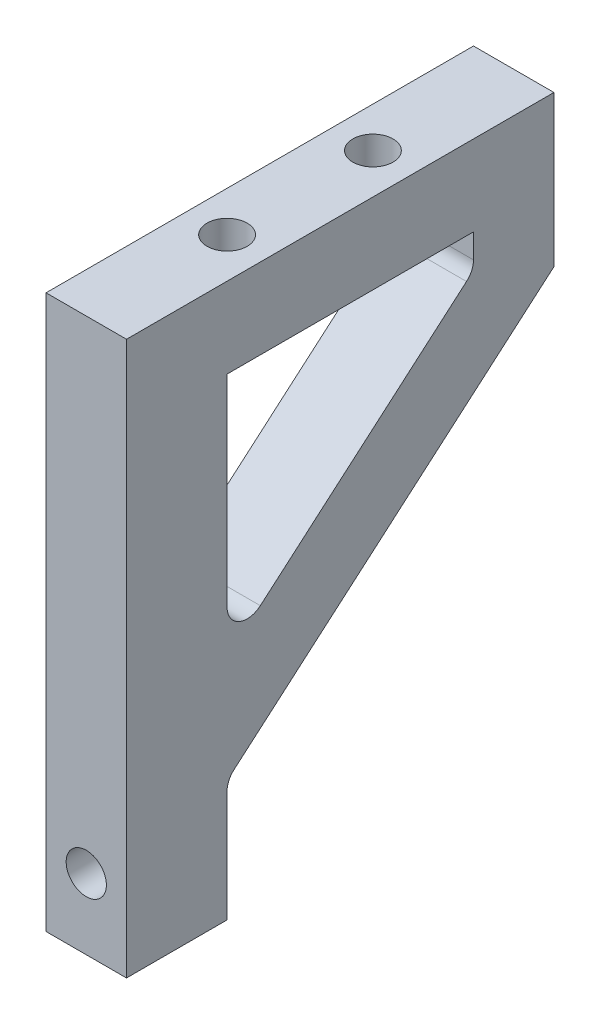
ISO-10303-21;
HEADER;
FILE_DESCRIPTION(('STEP AP214'),'2;1');
FILE_NAME('part.step','',(''),(''),'','','');
FILE_SCHEMA(('AUTOMOTIVE_DESIGN { 1 0 10303 214 1 1 1 1 }'));
ENDSEC;
DATA;
#1=APPLICATION_CONTEXT('core data for automotive mechanical design processes');
#2=APPLICATION_PROTOCOL_DEFINITION('international standard','automotive_design',2000,#1);
#3=PRODUCT_CONTEXT('',#1,'mechanical');
#4=PRODUCT('Part','Part','',(#3));
#5=PRODUCT_RELATED_PRODUCT_CATEGORY('part','',(#4));
#6=PRODUCT_DEFINITION_FORMATION('','',#4);
#7=PRODUCT_DEFINITION_CONTEXT('part definition',#1,'design');
#8=PRODUCT_DEFINITION('design','',#6,#7);
#9=PRODUCT_DEFINITION_SHAPE('','',#8);
#10=(LENGTH_UNIT() NAMED_UNIT(*) SI_UNIT(.MILLI.,.METRE.));
#11=(NAMED_UNIT(*) PLANE_ANGLE_UNIT() SI_UNIT($,.RADIAN.));
#12=(NAMED_UNIT(*) SI_UNIT($,.STERADIAN.) SOLID_ANGLE_UNIT());
#13=UNCERTAINTY_MEASURE_WITH_UNIT(LENGTH_MEASURE(1.E-05),#10,'distance_accuracy_value','');
#14=(GEOMETRIC_REPRESENTATION_CONTEXT(3) GLOBAL_UNCERTAINTY_ASSIGNED_CONTEXT((#13)) GLOBAL_UNIT_ASSIGNED_CONTEXT((#10,
#11,#12)) REPRESENTATION_CONTEXT('',''));
#15=CARTESIAN_POINT('',(0.,0.,0.));
#16=DIRECTION('',(0.,0.,1.));
#17=DIRECTION('',(1.,0.,0.));
#18=AXIS2_PLACEMENT_3D('',#15,#16,#17);
#19=CARTESIAN_POINT('',(4.,-43.,-10.));
#20=DIRECTION('',(0.,0.,1.));
#21=DIRECTION('',(0.,-1.,0.));
#22=AXIS2_PLACEMENT_3D('',#19,#20,#21);
#23=PLANE('',#22);
#24=DIRECTION('',(0.,1.,0.));
#25=VECTOR('',#24,1.);
#26=CARTESIAN_POINT('',(-4.,-43.,-10.));
#27=LINE('',#26,#25);
#28=CARTESIAN_POINT('',(-4.,-55.,-10.));
#29=VERTEX_POINT('',#28);
#30=CARTESIAN_POINT('',(-4.,-48.,-10.));
#31=VERTEX_POINT('',#30);
#32=EDGE_CURVE('E203',#29,#31,#27,.T.);
#33=ORIENTED_EDGE('',*,*,#32,.T.);
#34=CARTESIAN_POINT('',(0.,-48.,-10.));
#35=DIRECTION('',(0.,0.,1.));
#36=DIRECTION('',(0.,-1.,0.));
#37=AXIS2_PLACEMENT_3D('',#34,#35,#36);
#38=CIRCLE('',#37,4.00000000000002);
#39=CARTESIAN_POINT('',(4.,-48.,-10.));
#40=VERTEX_POINT('',#39);
#41=EDGE_CURVE('E11',#31,#40,#38,.T.);
#42=ORIENTED_EDGE('',*,*,#41,.T.);
#43=DIRECTION('',(0.,1.,0.));
#44=VECTOR('',#43,1.);
#45=CARTESIAN_POINT('',(4.,-43.,-10.));
#46=LINE('',#45,#44);
#47=CARTESIAN_POINT('',(4.,-55.,-10.));
#48=VERTEX_POINT('',#47);
#49=EDGE_CURVE('E188',#48,#40,#46,.T.);
#50=ORIENTED_EDGE('',*,*,#49,.F.);
#51=DIRECTION('',(-1.,0.,0.));
#52=VECTOR('',#51,1.);
#53=CARTESIAN_POINT('',(4.,-55.,-10.));
#54=LINE('',#53,#52);
#55=EDGE_CURVE('E219',#48,#29,#54,.T.);
#56=ORIENTED_EDGE('',*,*,#55,.T.);
#57=EDGE_LOOP('',(#33,#42,#50,#56));
#58=FACE_BOUND('',#57,.T.);
#59=ADVANCED_FACE('F37',(#58),#23,.F.);
#60=CARTESIAN_POINT('',(4.,0.,0.));
#61=DIRECTION('',(-1.,0.,0.));
#62=DIRECTION('',(0.,0.,1.));
#63=AXIS2_PLACEMENT_3D('',#60,#61,#62);
#64=PLANE('',#63);
#65=DIRECTION('',(0.,-1.,0.));
#66=VECTOR('',#65,1.);
#67=CARTESIAN_POINT('',(4.,-55.,0.));
#68=LINE('',#67,#66);
#69=CARTESIAN_POINT('',(4.,0.,0.));
#70=VERTEX_POINT('',#69);
#71=CARTESIAN_POINT('',(4.,-55.,0.));
#72=VERTEX_POINT('',#71);
#73=EDGE_CURVE('E181',#70,#72,#68,.T.);
#74=ORIENTED_EDGE('',*,*,#73,.T.);
#75=DIRECTION('',(0.,0.,-1.));
#76=VECTOR('',#75,1.);
#77=CARTESIAN_POINT('',(4.,-55.,-10.));
#78=LINE('',#77,#76);
#79=EDGE_CURVE('E184',#72,#48,#78,.T.);
#80=ORIENTED_EDGE('',*,*,#79,.T.);
#81=ORIENTED_EDGE('',*,*,#49,.T.);
#82=CARTESIAN_POINT('',(4.,-43.916808317391,-10.));
#83=VERTEX_POINT('',#82);
#84=EDGE_CURVE('E187',#40,#83,#46,.T.);
#85=ORIENTED_EDGE('',*,*,#84,.T.);
#86=CARTESIAN_POINT('',(4.,-43.916808317391,-12.));
#87=DIRECTION('',(-1.,0.,0.));
#88=DIRECTION('',(0.,0.,1.));
#89=AXIS2_PLACEMENT_3D('',#86,#87,#88);
#90=CIRCLE('',#89,2.);
#91=CARTESIAN_POINT('',(4.,-42.4015909364676,-10.694581948743));
#92=VERTEX_POINT('',#91);
#93=EDGE_CURVE('E247',#83,#92,#90,.T.);
#94=ORIENTED_EDGE('',*,*,#93,.T.);
#95=DIRECTION('',(0.,0.652709025628525,-0.75760869046168));
#96=VECTOR('',#95,1.);
#97=CARTESIAN_POINT('',(4.,-15.,-42.5));
#98=LINE('',#97,#96);
#99=CARTESIAN_POINT('',(4.,-15.,-42.5));
#100=VERTEX_POINT('',#99);
#101=EDGE_CURVE('E191',#92,#100,#98,.T.);
#102=ORIENTED_EDGE('',*,*,#101,.T.);
#103=DIRECTION('',(0.,1.,0.));
#104=VECTOR('',#103,1.);
#105=CARTESIAN_POINT('',(4.,0.,-42.5));
#106=LINE('',#105,#104);
#107=CARTESIAN_POINT('',(4.,0.,-42.5));
#108=VERTEX_POINT('',#107);
#109=EDGE_CURVE('E193',#100,#108,#106,.T.);
#110=ORIENTED_EDGE('',*,*,#109,.T.);
#111=DIRECTION('',(0.,0.,1.));
#112=VECTOR('',#111,1.);
#113=CARTESIAN_POINT('',(4.,0.,0.));
#114=LINE('',#113,#112);
#115=EDGE_CURVE('E195',#108,#70,#114,.T.);
#116=ORIENTED_EDGE('',*,*,#115,.T.);
#117=EDGE_LOOP('',(#74,#80,#81,#85,#94,#102,#110,#116));
#118=FACE_BOUND('',#117,.T.);
#119=DIRECTION('',(0.,0.,1.));
#120=VECTOR('',#119,1.);
#121=CARTESIAN_POINT('',(4.,-7.99999999999999,-34.5));
#122=LINE('',#121,#120);
#123=CARTESIAN_POINT('',(4.,-7.99999999999999,-34.5));
#124=VERTEX_POINT('',#123);
#125=CARTESIAN_POINT('',(4.,-8.,-9.99999999999999));
#126=VERTEX_POINT('',#125);
#127=EDGE_CURVE('E137',#124,#126,#122,.T.);
#128=ORIENTED_EDGE('',*,*,#127,.F.);
#129=DIRECTION('',(0.,1.,0.));
#130=VECTOR('',#129,1.);
#131=CARTESIAN_POINT('',(4.,-11.3327667304361,-34.5));
#132=LINE('',#131,#130);
#133=CARTESIAN_POINT('',(4.,-10.4159584130451,-34.5));
#134=VERTEX_POINT('',#133);
#135=EDGE_CURVE('E167',#134,#124,#132,.T.);
#136=ORIENTED_EDGE('',*,*,#135,.F.);
#137=CARTESIAN_POINT('',(4.,-10.4159584130451,-32.5));
#138=DIRECTION('',(-1.,0.,0.));
#139=DIRECTION('',(0.,0.,1.));
#140=AXIS2_PLACEMENT_3D('',#137,#138,#139);
#141=CIRCLE('',#140,2.);
#142=CARTESIAN_POINT('',(4.,-11.9311757939685,-33.805418051257));
#143=VERTEX_POINT('',#142);
#144=EDGE_CURVE('E242',#134,#143,#141,.T.);
#145=ORIENTED_EDGE('',*,*,#144,.T.);
#146=DIRECTION('',(0.,0.652709025628525,-0.75760869046168));
#147=VECTOR('',#146,1.);
#148=CARTESIAN_POINT('',(4.,-32.4404590381284,-10.));
#149=LINE('',#148,#147);
#150=CARTESIAN_POINT('',(4.,-29.5927142555069,-13.305418051257));
#151=VERTEX_POINT('',#150);
#152=EDGE_CURVE('E164',#151,#143,#149,.T.);
#153=ORIENTED_EDGE('',*,*,#152,.F.);
#154=CARTESIAN_POINT('',(4.,-28.0774968745836,-12.));
#155=DIRECTION('',(-1.,0.,0.));
#156=DIRECTION('',(0.,0.,1.));
#157=AXIS2_PLACEMENT_3D('',#154,#155,#156);
#158=CIRCLE('',#157,2.);
#159=CARTESIAN_POINT('',(4.,-28.0774968745836,-10.));
#160=VERTEX_POINT('',#159);
#161=EDGE_CURVE('E163',#151,#160,#158,.T.);
#162=ORIENTED_EDGE('',*,*,#161,.T.);
#163=DIRECTION('',(0.,-1.,0.));
#164=VECTOR('',#163,1.);
#165=CARTESIAN_POINT('',(4.,-8.,-9.99999999999999));
#166=LINE('',#165,#164);
#167=EDGE_CURVE('E148',#126,#160,#166,.T.);
#168=ORIENTED_EDGE('',*,*,#167,.F.);
#169=EDGE_LOOP('',(#128,#136,#145,#153,#162,#168));
#170=FACE_BOUND('',#169,.T.);
#171=ADVANCED_FACE('F160',(#118,#170),#64,.F.);
#172=CARTESIAN_POINT('',(-4.,0.,0.));
#173=DIRECTION('',(-1.,0.,0.));
#174=DIRECTION('',(0.,0.,1.));
#175=AXIS2_PLACEMENT_3D('',#172,#173,#174);
#176=PLANE('',#175);
#177=DIRECTION('',(0.,-1.,0.));
#178=VECTOR('',#177,1.);
#179=CARTESIAN_POINT('',(-4.,-55.,0.));
#180=LINE('',#179,#178);
#181=CARTESIAN_POINT('',(-4.,0.,0.));
#182=VERTEX_POINT('',#181);
#183=CARTESIAN_POINT('',(-4.,-55.,0.));
#184=VERTEX_POINT('',#183);
#185=EDGE_CURVE('E158',#182,#184,#180,.T.);
#186=ORIENTED_EDGE('',*,*,#185,.F.);
#187=DIRECTION('',(0.,0.,1.));
#188=VECTOR('',#187,1.);
#189=CARTESIAN_POINT('',(-4.,0.,0.));
#190=LINE('',#189,#188);
#191=CARTESIAN_POINT('',(-4.,0.,-42.5));
#192=VERTEX_POINT('',#191);
#193=EDGE_CURVE('E185',#192,#182,#190,.T.);
#194=ORIENTED_EDGE('',*,*,#193,.F.);
#195=DIRECTION('',(0.,1.,0.));
#196=VECTOR('',#195,1.);
#197=CARTESIAN_POINT('',(-4.,0.,-42.5));
#198=LINE('',#197,#196);
#199=CARTESIAN_POINT('',(-4.,-15.,-42.5));
#200=VERTEX_POINT('',#199);
#201=EDGE_CURVE('E208',#200,#192,#198,.T.);
#202=ORIENTED_EDGE('',*,*,#201,.F.);
#203=DIRECTION('',(0.,0.652709025628525,-0.75760869046168));
#204=VECTOR('',#203,1.);
#205=CARTESIAN_POINT('',(-4.,-15.,-42.5));
#206=LINE('',#205,#204);
#207=CARTESIAN_POINT('',(-4.,-42.4015909364676,-10.694581948743));
#208=VERTEX_POINT('',#207);
#209=EDGE_CURVE('E206',#208,#200,#206,.T.);
#210=ORIENTED_EDGE('',*,*,#209,.F.);
#211=CARTESIAN_POINT('',(-4.,-43.916808317391,-12.));
#212=DIRECTION('',(-1.,0.,0.));
#213=DIRECTION('',(0.,0.,1.));
#214=AXIS2_PLACEMENT_3D('',#211,#212,#213);
#215=CIRCLE('',#214,2.);
#216=CARTESIAN_POINT('',(-4.,-43.916808317391,-10.));
#217=VERTEX_POINT('',#216);
#218=EDGE_CURVE('E244',#208,#217,#215,.F.);
#219=ORIENTED_EDGE('',*,*,#218,.T.);
#220=EDGE_CURVE('E202',#31,#217,#27,.T.);
#221=ORIENTED_EDGE('',*,*,#220,.F.);
#222=ORIENTED_EDGE('',*,*,#32,.F.);
#223=DIRECTION('',(0.,0.,-1.));
#224=VECTOR('',#223,1.);
#225=CARTESIAN_POINT('',(-4.,-55.,-10.));
#226=LINE('',#225,#224);
#227=EDGE_CURVE('E200',#184,#29,#226,.T.);
#228=ORIENTED_EDGE('',*,*,#227,.F.);
#229=EDGE_LOOP('',(#186,#194,#202,#210,#219,#221,#222,#228));
#230=FACE_BOUND('',#229,.T.);
#231=DIRECTION('',(0.,0.652709025628525,-0.75760869046168));
#232=VECTOR('',#231,1.);
#233=CARTESIAN_POINT('',(-4.,-32.4404590381284,-10.));
#234=LINE('',#233,#232);
#235=CARTESIAN_POINT('',(-4.,-29.5927142555069,-13.305418051257));
#236=VERTEX_POINT('',#235);
#237=CARTESIAN_POINT('',(-4.,-11.9311757939685,-33.805418051257));
#238=VERTEX_POINT('',#237);
#239=EDGE_CURVE('E176',#236,#238,#234,.T.);
#240=ORIENTED_EDGE('',*,*,#239,.T.);
#241=CARTESIAN_POINT('',(-4.,-10.4159584130451,-32.5));
#242=DIRECTION('',(-1.,0.,0.));
#243=DIRECTION('',(0.,0.,1.));
#244=AXIS2_PLACEMENT_3D('',#241,#242,#243);
#245=CIRCLE('',#244,2.);
#246=CARTESIAN_POINT('',(-4.,-10.4159584130451,-34.5));
#247=VERTEX_POINT('',#246);
#248=EDGE_CURVE('E240',#238,#247,#245,.F.);
#249=ORIENTED_EDGE('',*,*,#248,.T.);
#250=DIRECTION('',(0.,1.,0.));
#251=VECTOR('',#250,1.);
#252=CARTESIAN_POINT('',(-4.,-11.3327667304361,-34.5));
#253=LINE('',#252,#251);
#254=CARTESIAN_POINT('',(-4.,-7.99999999999999,-34.5));
#255=VERTEX_POINT('',#254);
#256=EDGE_CURVE('E149',#247,#255,#253,.T.);
#257=ORIENTED_EDGE('',*,*,#256,.T.);
#258=DIRECTION('',(0.,0.,1.));
#259=VECTOR('',#258,1.);
#260=CARTESIAN_POINT('',(-4.,-7.99999999999999,-34.5));
#261=LINE('',#260,#259);
#262=CARTESIAN_POINT('',(-4.,-8.,-9.99999999999999));
#263=VERTEX_POINT('',#262);
#264=EDGE_CURVE('E172',#255,#263,#261,.T.);
#265=ORIENTED_EDGE('',*,*,#264,.T.);
#266=DIRECTION('',(0.,-1.,0.));
#267=VECTOR('',#266,1.);
#268=CARTESIAN_POINT('',(-4.,-8.,-9.99999999999999));
#269=LINE('',#268,#267);
#270=CARTESIAN_POINT('',(-4.,-28.0774968745836,-10.));
#271=VERTEX_POINT('',#270);
#272=EDGE_CURVE('E157',#263,#271,#269,.T.);
#273=ORIENTED_EDGE('',*,*,#272,.T.);
#274=CARTESIAN_POINT('',(-4.,-28.0774968745836,-12.));
#275=DIRECTION('',(-1.,0.,0.));
#276=DIRECTION('',(0.,0.,1.));
#277=AXIS2_PLACEMENT_3D('',#274,#275,#276);
#278=CIRCLE('',#277,2.);
#279=EDGE_CURVE('E249',#271,#236,#278,.F.);
#280=ORIENTED_EDGE('',*,*,#279,.T.);
#281=EDGE_LOOP('',(#240,#249,#257,#265,#273,#280));
#282=FACE_BOUND('',#281,.T.);
#283=ADVANCED_FACE('F273',(#230,#282),#176,.T.);
#284=CARTESIAN_POINT('',(4.,-55.,0.));
#285=DIRECTION('',(0.,0.,-1.));
#286=DIRECTION('',(-1.,0.,0.));
#287=AXIS2_PLACEMENT_3D('',#284,#285,#286);
#288=PLANE('',#287);
#289=CARTESIAN_POINT('',(0.,-48.,0.));
#290=DIRECTION('',(0.,0.,-1.));
#291=DIRECTION('',(-1.,0.,0.));
#292=AXIS2_PLACEMENT_3D('',#289,#290,#291);
#293=CIRCLE('',#292,2.);
#294=CARTESIAN_POINT('',(-2.,-48.,0.));
#295=VERTEX_POINT('',#294);
#296=EDGE_CURVE('E475',#295,#295,#293,.F.);
#297=ORIENTED_EDGE('',*,*,#296,.F.);
#298=EDGE_LOOP('',(#297));
#299=FACE_BOUND('',#298,.T.);
#300=ORIENTED_EDGE('',*,*,#185,.T.);
#301=DIRECTION('',(-1.,0.,0.));
#302=VECTOR('',#301,1.);
#303=CARTESIAN_POINT('',(4.,-55.,0.));
#304=LINE('',#303,#302);
#305=EDGE_CURVE('E222',#72,#184,#304,.T.);
#306=ORIENTED_EDGE('',*,*,#305,.F.);
#307=ORIENTED_EDGE('',*,*,#73,.F.);
#308=DIRECTION('',(-1.,0.,0.));
#309=VECTOR('',#308,1.);
#310=CARTESIAN_POINT('',(4.,0.,0.));
#311=LINE('',#310,#309);
#312=EDGE_CURVE('E197',#70,#182,#311,.T.);
#313=ORIENTED_EDGE('',*,*,#312,.T.);
#314=EDGE_LOOP('',(#300,#306,#307,#313));
#315=FACE_BOUND('',#314,.T.);
#316=ADVANCED_FACE('F287',(#299,#315),#288,.F.);
#317=CARTESIAN_POINT('',(4.,-55.,-10.));
#318=DIRECTION('',(0.,1.,0.));
#319=DIRECTION('',(0.,0.,1.));
#320=AXIS2_PLACEMENT_3D('',#317,#318,#319);
#321=PLANE('',#320);
#322=ORIENTED_EDGE('',*,*,#227,.T.);
#323=ORIENTED_EDGE('',*,*,#55,.F.);
#324=ORIENTED_EDGE('',*,*,#79,.F.);
#325=ORIENTED_EDGE('',*,*,#305,.T.);
#326=EDGE_LOOP('',(#322,#323,#324,#325));
#327=FACE_BOUND('',#326,.T.);
#328=ADVANCED_FACE('F280',(#327),#321,.F.);
#329=ORIENTED_EDGE('',*,*,#84,.F.);
#330=CARTESIAN_POINT('',(0.,-48.,-10.));
#331=DIRECTION('',(0.,0.,1.));
#332=DIRECTION('',(0.,-1.,0.));
#333=AXIS2_PLACEMENT_3D('',#330,#331,#332);
#334=CIRCLE('',#333,4.00000000000002);
#335=EDGE_CURVE('E46',#40,#31,#334,.T.);
#336=ORIENTED_EDGE('',*,*,#335,.T.);
#337=ORIENTED_EDGE('',*,*,#220,.T.);
#338=DIRECTION('',(-1.,0.,0.));
#339=VECTOR('',#338,1.);
#340=CARTESIAN_POINT('',(4.,-43.916808317391,-10.));
#341=LINE('',#340,#339);
#342=EDGE_CURVE('E235',#217,#83,#341,.F.);
#343=ORIENTED_EDGE('',*,*,#342,.T.);
#344=EDGE_LOOP('',(#329,#336,#337,#343));
#345=FACE_BOUND('',#344,.T.);
#346=ADVANCED_FACE('F269',(#345),#23,.F.);
#347=CARTESIAN_POINT('',(4.,-15.,-42.5));
#348=DIRECTION('',(0.,0.75760869046168,0.652709025628525));
#349=DIRECTION('',(0.,-0.652709025628525,0.75760869046168));
#350=AXIS2_PLACEMENT_3D('',#347,#348,#349);
#351=PLANE('',#350);
#352=ORIENTED_EDGE('',*,*,#101,.F.);
#353=DIRECTION('',(-1.,0.,0.));
#354=VECTOR('',#353,1.);
#355=CARTESIAN_POINT('',(-4.,-42.4015909364676,-10.694581948743));
#356=LINE('',#355,#354);
#357=EDGE_CURVE('E232',#92,#208,#356,.T.);
#358=ORIENTED_EDGE('',*,*,#357,.T.);
#359=ORIENTED_EDGE('',*,*,#209,.T.);
#360=DIRECTION('',(-1.,0.,0.));
#361=VECTOR('',#360,1.);
#362=CARTESIAN_POINT('',(4.,-15.,-42.5));
#363=LINE('',#362,#361);
#364=EDGE_CURVE('E216',#100,#200,#363,.T.);
#365=ORIENTED_EDGE('',*,*,#364,.F.);
#366=EDGE_LOOP('',(#352,#358,#359,#365));
#367=FACE_BOUND('',#366,.T.);
#368=ADVANCED_FACE('F279',(#367),#351,.F.);
#369=CARTESIAN_POINT('',(4.,0.,-42.5));
#370=DIRECTION('',(0.,0.,1.));
#371=DIRECTION('',(1.,0.,0.));
#372=AXIS2_PLACEMENT_3D('',#369,#370,#371);
#373=PLANE('',#372);
#374=ORIENTED_EDGE('',*,*,#201,.T.);
#375=DIRECTION('',(-1.,0.,0.));
#376=VECTOR('',#375,1.);
#377=CARTESIAN_POINT('',(4.,0.,-42.5));
#378=LINE('',#377,#376);
#379=EDGE_CURVE('E213',#108,#192,#378,.T.);
#380=ORIENTED_EDGE('',*,*,#379,.F.);
#381=ORIENTED_EDGE('',*,*,#109,.F.);
#382=ORIENTED_EDGE('',*,*,#364,.T.);
#383=EDGE_LOOP('',(#374,#380,#381,#382));
#384=FACE_BOUND('',#383,.T.);
#385=ADVANCED_FACE('F285',(#384),#373,.F.);
#386=CARTESIAN_POINT('',(4.,0.,0.));
#387=DIRECTION('',(0.,-1.,0.));
#388=DIRECTION('',(0.,0.,-1.));
#389=AXIS2_PLACEMENT_3D('',#386,#387,#388);
#390=PLANE('',#389);
#391=CARTESIAN_POINT('',(0.,0.,-14.));
#392=DIRECTION('',(0.,1.,0.));
#393=DIRECTION('',(0.,0.,1.));
#394=AXIS2_PLACEMENT_3D('',#391,#392,#393);
#395=CIRCLE('',#394,2.);
#396=CARTESIAN_POINT('',(0.,0.,-12.));
#397=VERTEX_POINT('',#396);
#398=EDGE_CURVE('E174',#397,#397,#395,.T.);
#399=ORIENTED_EDGE('',*,*,#398,.F.);
#400=EDGE_LOOP('',(#399));
#401=FACE_BOUND('',#400,.T.);
#402=CARTESIAN_POINT('',(0.,0.,-28.5));
#403=DIRECTION('',(0.,1.,0.));
#404=DIRECTION('',(0.,0.,1.));
#405=AXIS2_PLACEMENT_3D('',#402,#403,#404);
#406=CIRCLE('',#405,2.);
#407=CARTESIAN_POINT('',(0.,0.,-26.5));
#408=VERTEX_POINT('',#407);
#409=EDGE_CURVE('E468',#408,#408,#406,.T.);
#410=ORIENTED_EDGE('',*,*,#409,.F.);
#411=EDGE_LOOP('',(#410));
#412=FACE_BOUND('',#411,.T.);
#413=ORIENTED_EDGE('',*,*,#193,.T.);
#414=ORIENTED_EDGE('',*,*,#312,.F.);
#415=ORIENTED_EDGE('',*,*,#115,.F.);
#416=ORIENTED_EDGE('',*,*,#379,.T.);
#417=EDGE_LOOP('',(#413,#414,#415,#416));
#418=FACE_BOUND('',#417,.T.);
#419=ADVANCED_FACE('F311',(#401,#412,#418),#390,.F.);
#420=CARTESIAN_POINT('',(4.,-7.99999999999999,-34.5));
#421=DIRECTION('',(0.,-1.,0.));
#422=DIRECTION('',(0.,0.,-1.));
#423=AXIS2_PLACEMENT_3D('',#420,#421,#422);
#424=PLANE('',#423);
#425=CARTESIAN_POINT('',(0.,-7.99999999999999,-14.));
#426=DIRECTION('',(0.,-1.,0.));
#427=DIRECTION('',(0.,0.,-1.));
#428=AXIS2_PLACEMENT_3D('',#425,#426,#427);
#429=CIRCLE('',#428,2.);
#430=CARTESIAN_POINT('',(0.,-7.99999999999999,-12.));
#431=VERTEX_POINT('',#430);
#432=EDGE_CURVE('E470',#431,#431,#429,.F.);
#433=ORIENTED_EDGE('',*,*,#432,.T.);
#434=EDGE_LOOP('',(#433));
#435=FACE_BOUND('',#434,.T.);
#436=CARTESIAN_POINT('',(0.,-7.99999999999999,-28.5));
#437=DIRECTION('',(0.,-1.,0.));
#438=DIRECTION('',(0.,0.,-1.));
#439=AXIS2_PLACEMENT_3D('',#436,#437,#438);
#440=CIRCLE('',#439,2.);
#441=CARTESIAN_POINT('',(0.,-7.99999999999999,-26.5));
#442=VERTEX_POINT('',#441);
#443=EDGE_CURVE('E471',#442,#442,#440,.F.);
#444=ORIENTED_EDGE('',*,*,#443,.T.);
#445=EDGE_LOOP('',(#444));
#446=FACE_BOUND('',#445,.T.);
#447=ORIENTED_EDGE('',*,*,#264,.F.);
#448=DIRECTION('',(-1.,0.,0.));
#449=VECTOR('',#448,1.);
#450=CARTESIAN_POINT('',(4.,-7.99999999999999,-34.5));
#451=LINE('',#450,#449);
#452=EDGE_CURVE('E144',#124,#255,#451,.T.);
#453=ORIENTED_EDGE('',*,*,#452,.F.);
#454=ORIENTED_EDGE('',*,*,#127,.T.);
#455=DIRECTION('',(-1.,0.,0.));
#456=VECTOR('',#455,1.);
#457=CARTESIAN_POINT('',(4.,-8.,-9.99999999999999));
#458=LINE('',#457,#456);
#459=EDGE_CURVE('E141',#126,#263,#458,.T.);
#460=ORIENTED_EDGE('',*,*,#459,.T.);
#461=EDGE_LOOP('',(#447,#453,#454,#460));
#462=FACE_BOUND('',#461,.T.);
#463=ADVANCED_FACE('F140',(#435,#446,#462),#424,.T.);
#464=CARTESIAN_POINT('',(4.,-8.,-9.99999999999999));
#465=DIRECTION('',(0.,0.,-1.));
#466=DIRECTION('',(0.,1.,0.));
#467=AXIS2_PLACEMENT_3D('',#464,#465,#466);
#468=PLANE('',#467);
#469=ORIENTED_EDGE('',*,*,#167,.T.);
#470=DIRECTION('',(-1.,0.,0.));
#471=VECTOR('',#470,1.);
#472=CARTESIAN_POINT('',(-4.,-28.0774968745836,-10.));
#473=LINE('',#472,#471);
#474=EDGE_CURVE('E238',#160,#271,#473,.T.);
#475=ORIENTED_EDGE('',*,*,#474,.T.);
#476=ORIENTED_EDGE('',*,*,#272,.F.);
#477=ORIENTED_EDGE('',*,*,#459,.F.);
#478=EDGE_LOOP('',(#469,#475,#476,#477));
#479=FACE_BOUND('',#478,.T.);
#480=ADVANCED_FACE('F153',(#479),#468,.T.);
#481=CARTESIAN_POINT('',(4.,-32.4404590381284,-10.));
#482=DIRECTION('',(0.,0.75760869046168,0.652709025628525));
#483=DIRECTION('',(0.,-0.652709025628525,0.75760869046168));
#484=AXIS2_PLACEMENT_3D('',#481,#482,#483);
#485=PLANE('',#484);
#486=ORIENTED_EDGE('',*,*,#152,.T.);
#487=DIRECTION('',(-1.,0.,0.));
#488=VECTOR('',#487,1.);
#489=CARTESIAN_POINT('',(-4.,-11.9311757939685,-33.805418051257));
#490=LINE('',#489,#488);
#491=EDGE_CURVE('E227',#143,#238,#490,.T.);
#492=ORIENTED_EDGE('',*,*,#491,.T.);
#493=ORIENTED_EDGE('',*,*,#239,.F.);
#494=DIRECTION('',(-1.,0.,0.));
#495=VECTOR('',#494,1.);
#496=CARTESIAN_POINT('',(4.,-29.5927142555069,-13.305418051257));
#497=LINE('',#496,#495);
#498=EDGE_CURVE('E225',#236,#151,#497,.F.);
#499=ORIENTED_EDGE('',*,*,#498,.T.);
#500=EDGE_LOOP('',(#486,#492,#493,#499));
#501=FACE_BOUND('',#500,.T.);
#502=ADVANCED_FACE('F398',(#501),#485,.T.);
#503=CARTESIAN_POINT('',(4.,-11.3327667304361,-34.5));
#504=DIRECTION('',(0.,0.,1.));
#505=DIRECTION('',(0.,-1.,0.));
#506=AXIS2_PLACEMENT_3D('',#503,#504,#505);
#507=PLANE('',#506);
#508=ORIENTED_EDGE('',*,*,#256,.F.);
#509=DIRECTION('',(-1.,0.,0.));
#510=VECTOR('',#509,1.);
#511=CARTESIAN_POINT('',(4.,-10.4159584130451,-34.5));
#512=LINE('',#511,#510);
#513=EDGE_CURVE('E230',#247,#134,#512,.F.);
#514=ORIENTED_EDGE('',*,*,#513,.T.);
#515=ORIENTED_EDGE('',*,*,#135,.T.);
#516=ORIENTED_EDGE('',*,*,#452,.T.);
#517=EDGE_LOOP('',(#508,#514,#515,#516));
#518=FACE_BOUND('',#517,.T.);
#519=ADVANCED_FACE('F389',(#518),#507,.T.);
#520=CARTESIAN_POINT('',(0.,-55.001,-28.5));
#521=DIRECTION('',(0.,1.,0.));
#522=DIRECTION('',(0.,0.,1.));
#523=AXIS2_PLACEMENT_3D('',#520,#521,#522);
#524=CYLINDRICAL_SURFACE('',#523,2.);
#525=CARTESIAN_POINT('',(0.,-7.99999999999999,-26.5));
#526=CARTESIAN_POINT('',(0.,-7.91666666666666,-26.5));
#527=CARTESIAN_POINT('',(0.,-7.83333333333333,-26.5));
#528=CARTESIAN_POINT('',(0.,-7.66666666666666,-26.5));
#529=CARTESIAN_POINT('',(0.,-7.58333333333333,-26.5));
#530=CARTESIAN_POINT('',(0.,-7.41666666666666,-26.5));
#531=CARTESIAN_POINT('',(0.,-7.33333333333333,-26.5));
#532=CARTESIAN_POINT('',(0.,-7.16666666666666,-26.5));
#533=CARTESIAN_POINT('',(0.,-7.08333333333333,-26.5));
#534=CARTESIAN_POINT('',(0.,-6.91666666666666,-26.5));
#535=CARTESIAN_POINT('',(0.,-6.83333333333333,-26.5));
#536=CARTESIAN_POINT('',(0.,-6.66666666666666,-26.5));
#537=CARTESIAN_POINT('',(0.,-6.58333333333333,-26.5));
#538=CARTESIAN_POINT('',(0.,-6.41666666666666,-26.5));
#539=CARTESIAN_POINT('',(0.,-6.33333333333333,-26.5));
#540=CARTESIAN_POINT('',(0.,-6.16666666666666,-26.5));
#541=CARTESIAN_POINT('',(0.,-6.08333333333333,-26.5));
#542=CARTESIAN_POINT('',(0.,-5.91666666666666,-26.5));
#543=CARTESIAN_POINT('',(0.,-5.83333333333333,-26.5));
#544=CARTESIAN_POINT('',(0.,-5.66666666666666,-26.5));
#545=CARTESIAN_POINT('',(0.,-5.58333333333333,-26.5));
#546=CARTESIAN_POINT('',(0.,-5.41666666666666,-26.5));
#547=CARTESIAN_POINT('',(0.,-5.33333333333333,-26.5));
#548=CARTESIAN_POINT('',(0.,-5.16666666666666,-26.5));
#549=CARTESIAN_POINT('',(0.,-5.08333333333333,-26.5));
#550=CARTESIAN_POINT('',(0.,-4.91666666666666,-26.5));
#551=CARTESIAN_POINT('',(0.,-4.83333333333333,-26.5));
#552=CARTESIAN_POINT('',(0.,-4.66666666666666,-26.5));
#553=CARTESIAN_POINT('',(0.,-4.58333333333333,-26.5));
#554=CARTESIAN_POINT('',(0.,-4.41666666666666,-26.5));
#555=CARTESIAN_POINT('',(0.,-4.33333333333333,-26.5));
#556=CARTESIAN_POINT('',(0.,-4.16666666666666,-26.5));
#557=CARTESIAN_POINT('',(0.,-4.08333333333333,-26.5));
#558=CARTESIAN_POINT('',(0.,-3.91666666666666,-26.5));
#559=CARTESIAN_POINT('',(0.,-3.83333333333333,-26.5));
#560=CARTESIAN_POINT('',(0.,-3.66666666666666,-26.5));
#561=CARTESIAN_POINT('',(0.,-3.58333333333333,-26.5));
#562=CARTESIAN_POINT('',(0.,-3.41666666666666,-26.5));
#563=CARTESIAN_POINT('',(0.,-3.33333333333333,-26.5));
#564=CARTESIAN_POINT('',(0.,-3.16666666666666,-26.5));
#565=CARTESIAN_POINT('',(0.,-3.08333333333333,-26.5));
#566=CARTESIAN_POINT('',(0.,-2.91666666666666,-26.5));
#567=CARTESIAN_POINT('',(0.,-2.83333333333333,-26.5));
#568=CARTESIAN_POINT('',(0.,-2.66666666666666,-26.5));
#569=CARTESIAN_POINT('',(0.,-2.58333333333333,-26.5));
#570=CARTESIAN_POINT('',(0.,-2.41666666666666,-26.5));
#571=CARTESIAN_POINT('',(0.,-2.33333333333333,-26.5));
#572=CARTESIAN_POINT('',(0.,-2.16666666666667,-26.5));
#573=CARTESIAN_POINT('',(0.,-2.08333333333334,-26.5));
#574=CARTESIAN_POINT('',(0.,-1.91666666666667,-26.5));
#575=CARTESIAN_POINT('',(0.,-1.83333333333334,-26.5));
#576=CARTESIAN_POINT('',(0.,-1.66666666666667,-26.5));
#577=CARTESIAN_POINT('',(0.,-1.58333333333333,-26.5));
#578=CARTESIAN_POINT('',(0.,-1.41666666666667,-26.5));
#579=CARTESIAN_POINT('',(0.,-1.33333333333333,-26.5));
#580=CARTESIAN_POINT('',(0.,-1.16666666666667,-26.5));
#581=CARTESIAN_POINT('',(0.,-1.08333333333333,-26.5));
#582=CARTESIAN_POINT('',(0.,-0.916666666666668,-26.5));
#583=CARTESIAN_POINT('',(0.,-0.833333333333334,-26.5));
#584=CARTESIAN_POINT('',(0.,-0.666666666666667,-26.5));
#585=CARTESIAN_POINT('',(0.,-0.583333333333334,-26.5));
#586=CARTESIAN_POINT('',(0.,-0.416666666666667,-26.5));
#587=CARTESIAN_POINT('',(0.,-0.333333333333334,-26.5));
#588=CARTESIAN_POINT('',(0.,-0.166666666666667,-26.5));
#589=CARTESIAN_POINT('',(0.,-0.0833333333333333,-26.5));
#590=CARTESIAN_POINT('',(0.,0.,-26.5));
#591=B_SPLINE_CURVE_WITH_KNOTS('',3,(#525,#526,#527,#528,#529,#530,#531,#532,#533,#534,#535,
#536,#537,#538,#539,#540,#541,#542,#543,#544,#545,#546,#547,#548,#549,#550,#551,#552,#553,#554,
#555,#556,#557,#558,#559,#560,#561,#562,#563,#564,#565,#566,#567,#568,#569,#570,#571,#572,#573,
#574,#575,#576,#577,#578,#579,#580,#581,#582,#583,#584,#585,#586,#587,#588,#589,#590),
.UNSPECIFIED.,.F.,.F.,(4,2,2,2,2,2,2,2,2,2,2,2,2,2,2,2,2,2,2,2,2,2,2,2,2,2,2,2,2,2,2,2,4),(0.,
0.25,0.5,0.750000000000001,1.,1.25,1.5,1.75,2.,2.25,2.5,2.75,3.,3.25,3.5,3.75,4.,4.25,4.5,4.75,
5.,5.25,5.5,5.74999999999999,5.99999999999999,6.24999999999999,6.49999999999999,
6.74999999999999,6.99999999999999,7.24999999999999,7.49999999999999,7.74999999999999,
7.99999999999999),.UNSPECIFIED.);
#592=EDGE_CURVE('BSEAM382',#442,#408,#591,.T.);
#593=ORIENTED_EDGE('',*,*,#443,.F.);
#594=ORIENTED_EDGE('',*,*,#409,.T.);
#595=ORIENTED_EDGE('',*,*,#592,.T.);
#596=ORIENTED_EDGE('',*,*,#592,.F.);
#597=EDGE_LOOP('',(#593,#595,#594,#596));
#598=FACE_BOUND('',#597,.T.);
#599=ADVANCED_FACE('F382',(#598),#524,.F.);
#600=CARTESIAN_POINT('',(0.,-55.001,-14.));
#601=DIRECTION('',(0.,1.,0.));
#602=DIRECTION('',(0.,0.,1.));
#603=AXIS2_PLACEMENT_3D('',#600,#601,#602);
#604=CYLINDRICAL_SURFACE('',#603,2.);
#605=CARTESIAN_POINT('',(0.,-7.99999999999999,-12.));
#606=CARTESIAN_POINT('',(0.,-7.91666666666666,-12.));
#607=CARTESIAN_POINT('',(0.,-7.83333333333333,-12.));
#608=CARTESIAN_POINT('',(0.,-7.66666666666666,-12.));
#609=CARTESIAN_POINT('',(0.,-7.58333333333333,-12.));
#610=CARTESIAN_POINT('',(0.,-7.41666666666666,-12.));
#611=CARTESIAN_POINT('',(0.,-7.33333333333333,-12.));
#612=CARTESIAN_POINT('',(0.,-7.16666666666666,-12.));
#613=CARTESIAN_POINT('',(0.,-7.08333333333333,-12.));
#614=CARTESIAN_POINT('',(0.,-6.91666666666666,-12.));
#615=CARTESIAN_POINT('',(0.,-6.83333333333333,-12.));
#616=CARTESIAN_POINT('',(0.,-6.66666666666666,-12.));
#617=CARTESIAN_POINT('',(0.,-6.58333333333333,-12.));
#618=CARTESIAN_POINT('',(0.,-6.41666666666666,-12.));
#619=CARTESIAN_POINT('',(0.,-6.33333333333333,-12.));
#620=CARTESIAN_POINT('',(0.,-6.16666666666666,-12.));
#621=CARTESIAN_POINT('',(0.,-6.08333333333333,-12.));
#622=CARTESIAN_POINT('',(0.,-5.91666666666666,-12.));
#623=CARTESIAN_POINT('',(0.,-5.83333333333333,-12.));
#624=CARTESIAN_POINT('',(0.,-5.66666666666666,-12.));
#625=CARTESIAN_POINT('',(0.,-5.58333333333333,-12.));
#626=CARTESIAN_POINT('',(0.,-5.41666666666666,-12.));
#627=CARTESIAN_POINT('',(0.,-5.33333333333333,-12.));
#628=CARTESIAN_POINT('',(0.,-5.16666666666666,-12.));
#629=CARTESIAN_POINT('',(0.,-5.08333333333333,-12.));
#630=CARTESIAN_POINT('',(0.,-4.91666666666666,-12.));
#631=CARTESIAN_POINT('',(0.,-4.83333333333333,-12.));
#632=CARTESIAN_POINT('',(0.,-4.66666666666666,-12.));
#633=CARTESIAN_POINT('',(0.,-4.58333333333333,-12.));
#634=CARTESIAN_POINT('',(0.,-4.41666666666666,-12.));
#635=CARTESIAN_POINT('',(0.,-4.33333333333333,-12.));
#636=CARTESIAN_POINT('',(0.,-4.16666666666666,-12.));
#637=CARTESIAN_POINT('',(0.,-4.08333333333333,-12.));
#638=CARTESIAN_POINT('',(0.,-3.91666666666666,-12.));
#639=CARTESIAN_POINT('',(0.,-3.83333333333333,-12.));
#640=CARTESIAN_POINT('',(0.,-3.66666666666666,-12.));
#641=CARTESIAN_POINT('',(0.,-3.58333333333333,-12.));
#642=CARTESIAN_POINT('',(0.,-3.41666666666666,-12.));
#643=CARTESIAN_POINT('',(0.,-3.33333333333333,-12.));
#644=CARTESIAN_POINT('',(0.,-3.16666666666666,-12.));
#645=CARTESIAN_POINT('',(0.,-3.08333333333333,-12.));
#646=CARTESIAN_POINT('',(0.,-2.91666666666666,-12.));
#647=CARTESIAN_POINT('',(0.,-2.83333333333333,-12.));
#648=CARTESIAN_POINT('',(0.,-2.66666666666666,-12.));
#649=CARTESIAN_POINT('',(0.,-2.58333333333333,-12.));
#650=CARTESIAN_POINT('',(0.,-2.41666666666666,-12.));
#651=CARTESIAN_POINT('',(0.,-2.33333333333333,-12.));
#652=CARTESIAN_POINT('',(0.,-2.16666666666667,-12.));
#653=CARTESIAN_POINT('',(0.,-2.08333333333334,-12.));
#654=CARTESIAN_POINT('',(0.,-1.91666666666667,-12.));
#655=CARTESIAN_POINT('',(0.,-1.83333333333334,-12.));
#656=CARTESIAN_POINT('',(0.,-1.66666666666667,-12.));
#657=CARTESIAN_POINT('',(0.,-1.58333333333333,-12.));
#658=CARTESIAN_POINT('',(0.,-1.41666666666667,-12.));
#659=CARTESIAN_POINT('',(0.,-1.33333333333333,-12.));
#660=CARTESIAN_POINT('',(0.,-1.16666666666667,-12.));
#661=CARTESIAN_POINT('',(0.,-1.08333333333333,-12.));
#662=CARTESIAN_POINT('',(0.,-0.916666666666668,-12.));
#663=CARTESIAN_POINT('',(0.,-0.833333333333334,-12.));
#664=CARTESIAN_POINT('',(0.,-0.666666666666667,-12.));
#665=CARTESIAN_POINT('',(0.,-0.583333333333334,-12.));
#666=CARTESIAN_POINT('',(0.,-0.416666666666667,-12.));
#667=CARTESIAN_POINT('',(0.,-0.333333333333334,-12.));
#668=CARTESIAN_POINT('',(0.,-0.166666666666667,-12.));
#669=CARTESIAN_POINT('',(0.,-0.0833333333333333,-12.));
#670=CARTESIAN_POINT('',(0.,0.,-12.));
#671=B_SPLINE_CURVE_WITH_KNOTS('',3,(#605,#606,#607,#608,#609,#610,#611,#612,#613,#614,#615,
#616,#617,#618,#619,#620,#621,#622,#623,#624,#625,#626,#627,#628,#629,#630,#631,#632,#633,#634,
#635,#636,#637,#638,#639,#640,#641,#642,#643,#644,#645,#646,#647,#648,#649,#650,#651,#652,#653,
#654,#655,#656,#657,#658,#659,#660,#661,#662,#663,#664,#665,#666,#667,#668,#669,#670),
.UNSPECIFIED.,.F.,.F.,(4,2,2,2,2,2,2,2,2,2,2,2,2,2,2,2,2,2,2,2,2,2,2,2,2,2,2,2,2,2,2,2,4),(0.,
0.25,0.5,0.750000000000001,1.,1.25,1.5,1.75,2.,2.25,2.5,2.75,3.,3.25,3.5,3.75,4.,4.25,4.5,4.75,
5.,5.25,5.5,5.74999999999999,5.99999999999999,6.24999999999999,6.49999999999999,
6.74999999999999,6.99999999999999,7.24999999999999,7.49999999999999,7.74999999999999,
7.99999999999999),.UNSPECIFIED.);
#672=EDGE_CURVE('BSEAM368',#431,#397,#671,.T.);
#673=ORIENTED_EDGE('',*,*,#432,.F.);
#674=ORIENTED_EDGE('',*,*,#398,.T.);
#675=ORIENTED_EDGE('',*,*,#672,.T.);
#676=ORIENTED_EDGE('',*,*,#672,.F.);
#677=EDGE_LOOP('',(#673,#675,#674,#676));
#678=FACE_BOUND('',#677,.T.);
#679=ADVANCED_FACE('F368',(#678),#604,.F.);
#680=CARTESIAN_POINT('',(0.,-48.,0.00100000000000273));
#681=DIRECTION('',(0.,0.,-1.));
#682=DIRECTION('',(0.,1.,0.));
#683=AXIS2_PLACEMENT_3D('',#680,#681,#682);
#684=CYLINDRICAL_SURFACE('',#683,2.);
#685=CARTESIAN_POINT('',(0.,-48.,-7.99999999999998));
#686=DIRECTION('',(0.,0.,1.));
#687=DIRECTION('',(1.,0.,0.));
#688=AXIS2_PLACEMENT_3D('',#685,#686,#687);
#689=CIRCLE('',#688,2.);
#690=CARTESIAN_POINT('',(2.,-48.,-7.99999999999998));
#691=VERTEX_POINT('',#690);
#692=EDGE_CURVE('E252',#691,#691,#689,.F.);
#693=ORIENTED_EDGE('',*,*,#692,.T.);
#694=EDGE_LOOP('',(#693));
#695=FACE_BOUND('',#694,.T.);
#696=ORIENTED_EDGE('',*,*,#296,.T.);
#697=EDGE_LOOP('',(#696));
#698=FACE_BOUND('',#697,.T.);
#699=ADVANCED_FACE('F256',(#695,#698),#684,.F.);
#700=CARTESIAN_POINT('',(4.,-10.4159584130451,-32.5));
#701=DIRECTION('',(1.,0.,0.));
#702=DIRECTION('',(0.,0.,-1.));
#703=AXIS2_PLACEMENT_3D('',#700,#701,#702);
#704=CYLINDRICAL_SURFACE('',#703,2.);
#705=ORIENTED_EDGE('',*,*,#144,.F.);
#706=ORIENTED_EDGE('',*,*,#513,.F.);
#707=ORIENTED_EDGE('',*,*,#248,.F.);
#708=ORIENTED_EDGE('',*,*,#491,.F.);
#709=EDGE_LOOP('',(#705,#706,#707,#708));
#710=FACE_BOUND('',#709,.T.);
#711=ADVANCED_FACE('F323',(#710),#704,.F.);
#712=CARTESIAN_POINT('',(4.,-43.916808317391,-12.));
#713=DIRECTION('',(1.,0.,0.));
#714=DIRECTION('',(0.,0.,-1.));
#715=AXIS2_PLACEMENT_3D('',#712,#713,#714);
#716=CYLINDRICAL_SURFACE('',#715,2.);
#717=ORIENTED_EDGE('',*,*,#93,.F.);
#718=ORIENTED_EDGE('',*,*,#342,.F.);
#719=ORIENTED_EDGE('',*,*,#218,.F.);
#720=ORIENTED_EDGE('',*,*,#357,.F.);
#721=EDGE_LOOP('',(#717,#718,#719,#720));
#722=FACE_BOUND('',#721,.T.);
#723=ADVANCED_FACE('F264',(#722),#716,.F.);
#724=CARTESIAN_POINT('',(4.,-28.0774968745836,-12.));
#725=DIRECTION('',(1.,0.,0.));
#726=DIRECTION('',(0.,0.,-1.));
#727=AXIS2_PLACEMENT_3D('',#724,#725,#726);
#728=CYLINDRICAL_SURFACE('',#727,2.);
#729=ORIENTED_EDGE('',*,*,#161,.F.);
#730=ORIENTED_EDGE('',*,*,#498,.F.);
#731=ORIENTED_EDGE('',*,*,#279,.F.);
#732=ORIENTED_EDGE('',*,*,#474,.F.);
#733=EDGE_LOOP('',(#729,#730,#731,#732));
#734=FACE_BOUND('',#733,.T.);
#735=ADVANCED_FACE('F260',(#734),#728,.F.);
#736=CARTESIAN_POINT('',(0.,-48.,-7.99999999999998));
#737=DIRECTION('',(0.,0.,-1.));
#738=DIRECTION('',(-1.,0.,0.));
#739=AXIS2_PLACEMENT_3D('',#736,#737,#738);
#740=CONICAL_SURFACE('',#739,2.,0.785398163397447);
#741=ORIENTED_EDGE('',*,*,#335,.F.);
#742=ORIENTED_EDGE('',*,*,#41,.F.);
#743=EDGE_LOOP('',(#741,#742));
#744=FACE_BOUND('',#743,.T.);
#745=ORIENTED_EDGE('',*,*,#692,.F.);
#746=EDGE_LOOP('',(#745));
#747=FACE_BOUND('',#746,.T.);
#748=ADVANCED_FACE('F40',(#744,#747),#740,.F.);
#749=CLOSED_SHELL('',(#59,#171,#283,#316,#328,#346,#368,#385,#419,#463,#480,#502,#519,#599,#679,
#699,#711,#723,#735,#748));
#750=MANIFOLD_SOLID_BREP('B2',#749);
#751=ADVANCED_BREP_SHAPE_REPRESENTATION('',(#18,#750),#14);
#752=SHAPE_DEFINITION_REPRESENTATION(#9,#751);
ENDSEC;
END-ISO-10303-21;
